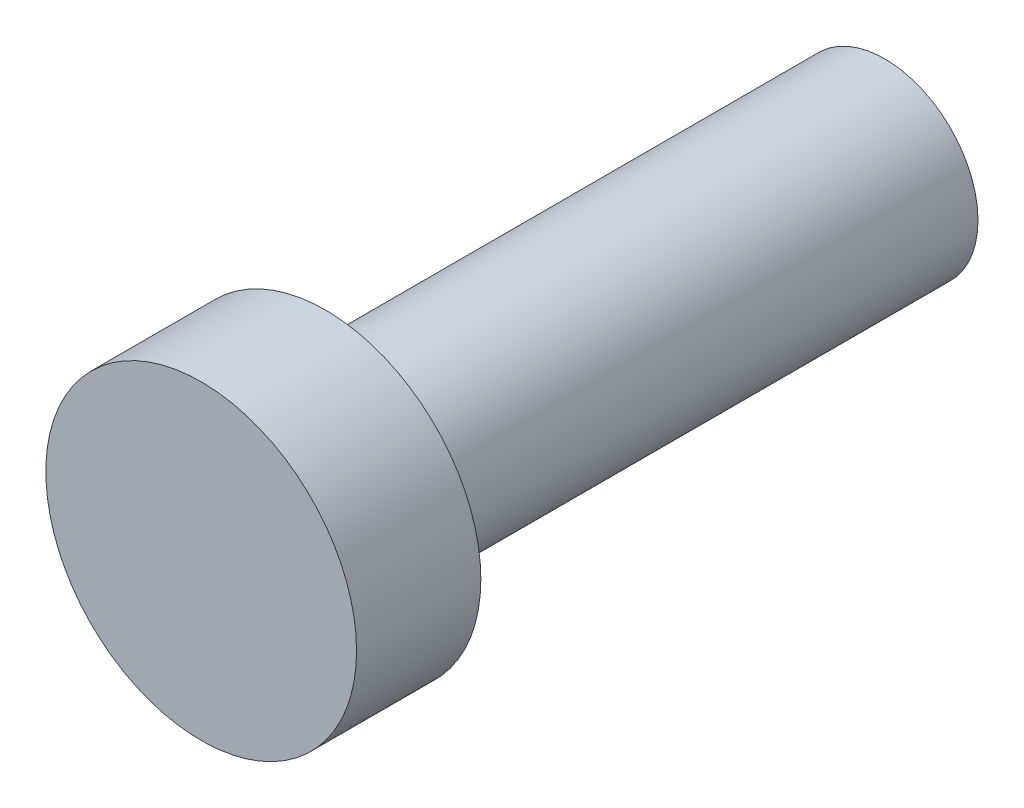
ISO-10303-21;
HEADER;
FILE_DESCRIPTION(('STEP AP214'),'2;1');
FILE_NAME('part.step','',(''),(''),'','','');
FILE_SCHEMA(('AUTOMOTIVE_DESIGN { 1 0 10303 214 1 1 1 1 }'));
ENDSEC;
DATA;
#1=APPLICATION_CONTEXT('core data for automotive mechanical design processes');
#2=APPLICATION_PROTOCOL_DEFINITION('international standard','automotive_design',2000,#1);
#3=PRODUCT_CONTEXT('',#1,'mechanical');
#4=PRODUCT('Part','Part','',(#3));
#5=PRODUCT_RELATED_PRODUCT_CATEGORY('part','',(#4));
#6=PRODUCT_DEFINITION_FORMATION('','',#4);
#7=PRODUCT_DEFINITION_CONTEXT('part definition',#1,'design');
#8=PRODUCT_DEFINITION('design','',#6,#7);
#9=PRODUCT_DEFINITION_SHAPE('','',#8);
#10=(LENGTH_UNIT() NAMED_UNIT(*) SI_UNIT(.MILLI.,.METRE.));
#11=(NAMED_UNIT(*) PLANE_ANGLE_UNIT() SI_UNIT($,.RADIAN.));
#12=(NAMED_UNIT(*) SI_UNIT($,.STERADIAN.) SOLID_ANGLE_UNIT());
#13=UNCERTAINTY_MEASURE_WITH_UNIT(LENGTH_MEASURE(1.E-05),#10,'distance_accuracy_value','');
#14=(GEOMETRIC_REPRESENTATION_CONTEXT(3) GLOBAL_UNCERTAINTY_ASSIGNED_CONTEXT((#13)) GLOBAL_UNIT_ASSIGNED_CONTEXT((#10,
#11,#12)) REPRESENTATION_CONTEXT('',''));
#15=CARTESIAN_POINT('',(0.,0.,0.));
#16=DIRECTION('',(0.,0.,1.));
#17=DIRECTION('',(1.,0.,0.));
#18=AXIS2_PLACEMENT_3D('',#15,#16,#17);
#19=CARTESIAN_POINT('',(0.,0.,0.749999999999998));
#20=DIRECTION('',(0.,0.,-1.));
#21=DIRECTION('',(-1.,0.,0.));
#22=AXIS2_PLACEMENT_3D('',#19,#20,#21);
#23=CYLINDRICAL_SURFACE('',#22,2.50000000000012);
#24=CARTESIAN_POINT('',(0.,0.,0.749999999999998));
#25=DIRECTION('',(0.,0.,1.));
#26=DIRECTION('',(1.,0.,0.));
#27=AXIS2_PLACEMENT_3D('',#24,#25,#26);
#28=CIRCLE('',#27,2.50000000000012);
#29=CARTESIAN_POINT('',(2.50000000000012,0.,0.749999999999998));
#30=VERTEX_POINT('',#29);
#31=EDGE_CURVE('E10',#30,#30,#28,.T.);
#32=ORIENTED_EDGE('',*,*,#31,.F.);
#33=EDGE_LOOP('',(#32));
#34=FACE_BOUND('',#33,.T.);
#35=CARTESIAN_POINT('',(0.,0.,-1.25));
#36=DIRECTION('',(0.,0.,1.));
#37=DIRECTION('',(1.,0.,0.));
#38=AXIS2_PLACEMENT_3D('',#35,#36,#37);
#39=CIRCLE('',#38,2.50000000000012);
#40=CARTESIAN_POINT('',(2.50000000000012,0.,-1.25));
#41=VERTEX_POINT('',#40);
#42=EDGE_CURVE('E48',#41,#41,#39,.T.);
#43=ORIENTED_EDGE('',*,*,#42,.T.);
#44=EDGE_LOOP('',(#43));
#45=FACE_BOUND('',#44,.T.);
#46=ADVANCED_FACE('F41',(#34,#45),#23,.T.);
#47=CARTESIAN_POINT('',(0.,0.,0.749999999999998));
#48=DIRECTION('',(0.,0.,1.));
#49=DIRECTION('',(1.,0.,0.));
#50=AXIS2_PLACEMENT_3D('',#47,#48,#49);
#51=PLANE('',#50);
#52=ORIENTED_EDGE('',*,*,#31,.T.);
#53=EDGE_LOOP('',(#52));
#54=FACE_BOUND('',#53,.T.);
#55=ADVANCED_FACE('F75',(#54),#51,.T.);
#56=CARTESIAN_POINT('',(0.,0.,-1.25));
#57=DIRECTION('',(0.,0.,1.));
#58=DIRECTION('',(1.,0.,0.));
#59=AXIS2_PLACEMENT_3D('',#56,#57,#58);
#60=PLANE('',#59);
#61=CARTESIAN_POINT('',(0.,0.,-1.25));
#62=DIRECTION('',(0.,0.,1.));
#63=DIRECTION('',(1.,0.,0.));
#64=AXIS2_PLACEMENT_3D('',#61,#62,#63);
#65=CIRCLE('',#64,1.5);
#66=CARTESIAN_POINT('',(1.5,0.,-1.25));
#67=VERTEX_POINT('',#66);
#68=EDGE_CURVE('E44',#67,#67,#65,.T.);
#69=ORIENTED_EDGE('',*,*,#68,.T.);
#70=EDGE_LOOP('',(#69));
#71=FACE_BOUND('',#70,.T.);
#72=ORIENTED_EDGE('',*,*,#42,.F.);
#73=EDGE_LOOP('',(#72));
#74=FACE_BOUND('',#73,.T.);
#75=ADVANCED_FACE('F61',(#71,#74),#60,.F.);
#76=CARTESIAN_POINT('',(0.,0.,-10.25));
#77=DIRECTION('',(0.,0.,1.));
#78=DIRECTION('',(1.,0.,0.));
#79=AXIS2_PLACEMENT_3D('',#76,#77,#78);
#80=CYLINDRICAL_SURFACE('',#79,1.5);
#81=CARTESIAN_POINT('',(0.,0.,-10.25));
#82=DIRECTION('',(0.,0.,1.));
#83=DIRECTION('',(1.,0.,0.));
#84=AXIS2_PLACEMENT_3D('',#81,#82,#83);
#85=CIRCLE('',#84,1.5);
#86=CARTESIAN_POINT('',(1.5,0.,-10.25));
#87=VERTEX_POINT('',#86);
#88=EDGE_CURVE('E54',#87,#87,#85,.T.);
#89=ORIENTED_EDGE('',*,*,#88,.T.);
#90=EDGE_LOOP('',(#89));
#91=FACE_BOUND('',#90,.T.);
#92=ORIENTED_EDGE('',*,*,#68,.F.);
#93=EDGE_LOOP('',(#92));
#94=FACE_BOUND('',#93,.T.);
#95=ADVANCED_FACE('F64',(#91,#94),#80,.T.);
#96=CARTESIAN_POINT('',(0.,0.,-10.25));
#97=DIRECTION('',(0.,0.,1.));
#98=DIRECTION('',(1.,0.,0.));
#99=AXIS2_PLACEMENT_3D('',#96,#97,#98);
#100=PLANE('',#99);
#101=ORIENTED_EDGE('',*,*,#88,.F.);
#102=EDGE_LOOP('',(#101));
#103=FACE_BOUND('',#102,.T.);
#104=ADVANCED_FACE('F66',(#103),#100,.F.);
#105=CLOSED_SHELL('',(#46,#55,#75,#95,#104));
#106=MANIFOLD_SOLID_BREP('B2',#105);
#107=ADVANCED_BREP_SHAPE_REPRESENTATION('',(#18,#106),#14);
#108=SHAPE_DEFINITION_REPRESENTATION(#9,#107);
ENDSEC;
END-ISO-10303-21;
